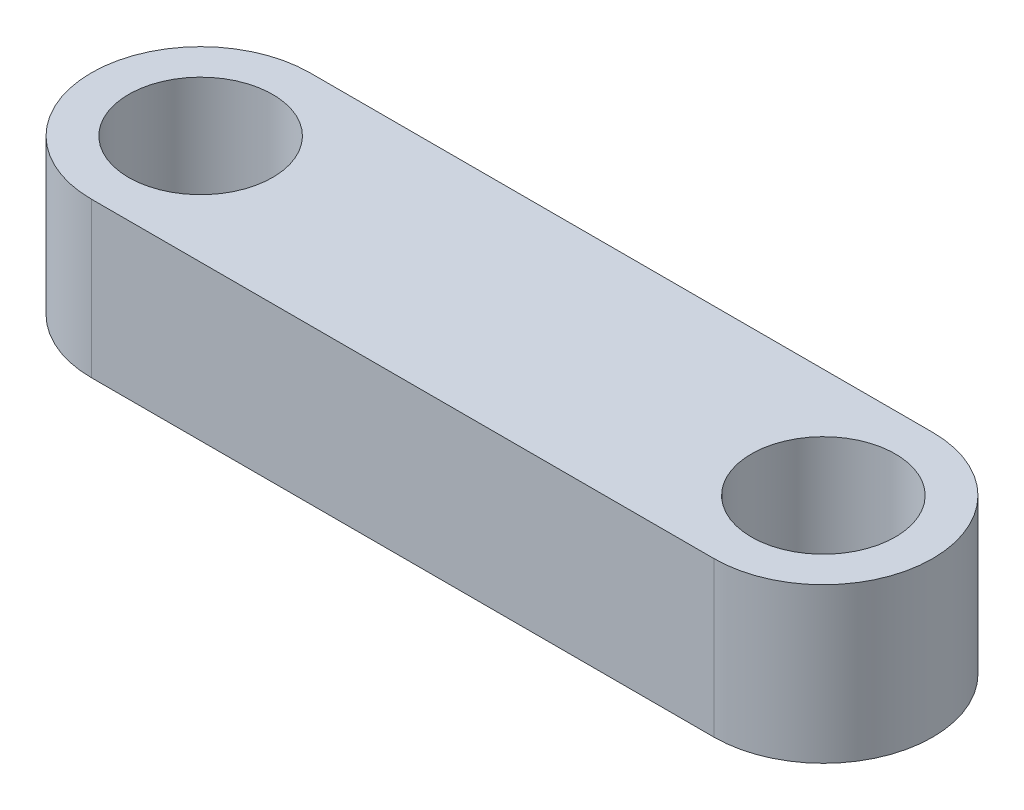
ISO-10303-21;
HEADER;
FILE_DESCRIPTION(('STEP AP214'),'2;1');
FILE_NAME('part.step','',(''),(''),'','','');
FILE_SCHEMA(('AUTOMOTIVE_DESIGN { 1 0 10303 214 1 1 1 1 }'));
ENDSEC;
DATA;
#1=APPLICATION_CONTEXT('core data for automotive mechanical design processes');
#2=APPLICATION_PROTOCOL_DEFINITION('international standard','automotive_design',2000,#1);
#3=PRODUCT_CONTEXT('',#1,'mechanical');
#4=PRODUCT('Part','Part','',(#3));
#5=PRODUCT_RELATED_PRODUCT_CATEGORY('part','',(#4));
#6=PRODUCT_DEFINITION_FORMATION('','',#4);
#7=PRODUCT_DEFINITION_CONTEXT('part definition',#1,'design');
#8=PRODUCT_DEFINITION('design','',#6,#7);
#9=PRODUCT_DEFINITION_SHAPE('','',#8);
#10=(LENGTH_UNIT() NAMED_UNIT(*) SI_UNIT(.MILLI.,.METRE.));
#11=(NAMED_UNIT(*) PLANE_ANGLE_UNIT() SI_UNIT($,.RADIAN.));
#12=(NAMED_UNIT(*) SI_UNIT($,.STERADIAN.) SOLID_ANGLE_UNIT());
#13=UNCERTAINTY_MEASURE_WITH_UNIT(LENGTH_MEASURE(1.E-05),#10,'distance_accuracy_value','');
#14=(GEOMETRIC_REPRESENTATION_CONTEXT(3) GLOBAL_UNCERTAINTY_ASSIGNED_CONTEXT((#13)) GLOBAL_UNIT_ASSIGNED_CONTEXT((#10,
#11,#12)) REPRESENTATION_CONTEXT('',''));
#15=CARTESIAN_POINT('',(0.,0.,0.));
#16=DIRECTION('',(0.,0.,1.));
#17=DIRECTION('',(1.,0.,0.));
#18=AXIS2_PLACEMENT_3D('',#15,#16,#17);
#19=CARTESIAN_POINT('',(-11.675,5.8,0.));
#20=DIRECTION('',(0.,1.,0.));
#21=DIRECTION('',(0.,0.,1.));
#22=AXIS2_PLACEMENT_3D('',#19,#20,#21);
#23=PLANE('',#22);
#24=CARTESIAN_POINT('',(-11.675,5.8,0.));
#25=DIRECTION('',(0.,1.,0.));
#26=DIRECTION('',(0.,0.,1.));
#27=AXIS2_PLACEMENT_3D('',#24,#25,#26);
#28=CIRCLE('',#27,2.7);
#29=CARTESIAN_POINT('',(-11.675,5.8,2.7));
#30=VERTEX_POINT('',#29);
#31=EDGE_CURVE('E123',#30,#30,#28,.T.);
#32=ORIENTED_EDGE('',*,*,#31,.F.);
#33=EDGE_LOOP('',(#32));
#34=FACE_BOUND('',#33,.T.);
#35=CARTESIAN_POINT('',(-11.675,5.8,0.));
#36=DIRECTION('',(0.,1.,0.));
#37=DIRECTION('',(0.,0.,1.));
#38=AXIS2_PLACEMENT_3D('',#35,#36,#37);
#39=CIRCLE('',#38,4.1);
#40=CARTESIAN_POINT('',(-11.675,5.8,-4.1));
#41=VERTEX_POINT('',#40);
#42=CARTESIAN_POINT('',(-11.675,5.8,4.1));
#43=VERTEX_POINT('',#42);
#44=EDGE_CURVE('E100',#41,#43,#39,.T.);
#45=ORIENTED_EDGE('',*,*,#44,.T.);
#46=DIRECTION('',(1.,0.,0.));
#47=VECTOR('',#46,1.);
#48=CARTESIAN_POINT('',(-11.675,5.8,4.1));
#49=LINE('',#48,#47);
#50=CARTESIAN_POINT('',(11.675,5.8,4.1));
#51=VERTEX_POINT('',#50);
#52=EDGE_CURVE('E95',#43,#51,#49,.T.);
#53=ORIENTED_EDGE('',*,*,#52,.T.);
#54=CARTESIAN_POINT('',(11.675,5.8,0.));
#55=DIRECTION('',(0.,1.,0.));
#56=DIRECTION('',(0.,0.,1.));
#57=AXIS2_PLACEMENT_3D('',#54,#55,#56);
#58=CIRCLE('',#57,4.1);
#59=CARTESIAN_POINT('',(11.675,5.8,-4.1));
#60=VERTEX_POINT('',#59);
#61=EDGE_CURVE('E98',#51,#60,#58,.T.);
#62=ORIENTED_EDGE('',*,*,#61,.T.);
#63=DIRECTION('',(-1.,0.,0.));
#64=VECTOR('',#63,1.);
#65=CARTESIAN_POINT('',(-11.675,5.8,-4.1));
#66=LINE('',#65,#64);
#67=EDGE_CURVE('E65',#60,#41,#66,.T.);
#68=ORIENTED_EDGE('',*,*,#67,.T.);
#69=EDGE_LOOP('',(#45,#53,#62,#68));
#70=FACE_BOUND('',#69,.T.);
#71=CARTESIAN_POINT('',(11.675,5.8,0.));
#72=DIRECTION('',(0.,1.,0.));
#73=DIRECTION('',(0.,0.,1.));
#74=AXIS2_PLACEMENT_3D('',#71,#72,#73);
#75=CIRCLE('',#74,2.7);
#76=CARTESIAN_POINT('',(11.675,5.8,2.7));
#77=VERTEX_POINT('',#76);
#78=EDGE_CURVE('E147',#77,#77,#75,.T.);
#79=ORIENTED_EDGE('',*,*,#78,.F.);
#80=EDGE_LOOP('',(#79));
#81=FACE_BOUND('',#80,.T.);
#82=ADVANCED_FACE('F47',(#34,#70,#81),#23,.T.);
#83=CARTESIAN_POINT('',(-11.675,0.,0.));
#84=DIRECTION('',(0.,1.,0.));
#85=DIRECTION('',(0.,0.,1.));
#86=AXIS2_PLACEMENT_3D('',#83,#84,#85);
#87=PLANE('',#86);
#88=CARTESIAN_POINT('',(-11.675,0.,0.));
#89=DIRECTION('',(0.,1.,0.));
#90=DIRECTION('',(0.,0.,1.));
#91=AXIS2_PLACEMENT_3D('',#88,#89,#90);
#92=CIRCLE('',#91,4.1);
#93=CARTESIAN_POINT('',(-11.675,0.,-4.1));
#94=VERTEX_POINT('',#93);
#95=CARTESIAN_POINT('',(-11.675,0.,4.1));
#96=VERTEX_POINT('',#95);
#97=EDGE_CURVE('E119',#94,#96,#92,.T.);
#98=ORIENTED_EDGE('',*,*,#97,.F.);
#99=DIRECTION('',(-1.,0.,0.));
#100=VECTOR('',#99,1.);
#101=CARTESIAN_POINT('',(-11.675,0.,-4.1));
#102=LINE('',#101,#100);
#103=CARTESIAN_POINT('',(11.675,0.,-4.1));
#104=VERTEX_POINT('',#103);
#105=EDGE_CURVE('E88',#104,#94,#102,.T.);
#106=ORIENTED_EDGE('',*,*,#105,.F.);
#107=CARTESIAN_POINT('',(11.675,0.,0.));
#108=DIRECTION('',(0.,1.,0.));
#109=DIRECTION('',(0.,0.,1.));
#110=AXIS2_PLACEMENT_3D('',#107,#108,#109);
#111=CIRCLE('',#110,4.1);
#112=CARTESIAN_POINT('',(11.675,0.,4.1));
#113=VERTEX_POINT('',#112);
#114=EDGE_CURVE('E82',#113,#104,#111,.T.);
#115=ORIENTED_EDGE('',*,*,#114,.F.);
#116=DIRECTION('',(1.,0.,0.));
#117=VECTOR('',#116,1.);
#118=CARTESIAN_POINT('',(-11.675,0.,4.1));
#119=LINE('',#118,#117);
#120=EDGE_CURVE('E105',#96,#113,#119,.T.);
#121=ORIENTED_EDGE('',*,*,#120,.F.);
#122=EDGE_LOOP('',(#98,#106,#115,#121));
#123=FACE_BOUND('',#122,.T.);
#124=CARTESIAN_POINT('',(-11.675,0.,0.));
#125=DIRECTION('',(0.,1.,0.));
#126=DIRECTION('',(0.,0.,1.));
#127=AXIS2_PLACEMENT_3D('',#124,#125,#126);
#128=CIRCLE('',#127,2.7);
#129=CARTESIAN_POINT('',(-11.675,0.,2.7));
#130=VERTEX_POINT('',#129);
#131=EDGE_CURVE('E143',#130,#130,#128,.T.);
#132=ORIENTED_EDGE('',*,*,#131,.T.);
#133=EDGE_LOOP('',(#132));
#134=FACE_BOUND('',#133,.T.);
#135=CARTESIAN_POINT('',(11.675,0.,0.));
#136=DIRECTION('',(0.,1.,0.));
#137=DIRECTION('',(0.,0.,1.));
#138=AXIS2_PLACEMENT_3D('',#135,#136,#137);
#139=CIRCLE('',#138,2.7);
#140=CARTESIAN_POINT('',(11.675,0.,2.7));
#141=VERTEX_POINT('',#140);
#142=EDGE_CURVE('E150',#141,#141,#139,.T.);
#143=ORIENTED_EDGE('',*,*,#142,.T.);
#144=EDGE_LOOP('',(#143));
#145=FACE_BOUND('',#144,.T.);
#146=ADVANCED_FACE('F138',(#123,#134,#145),#87,.F.);
#147=CARTESIAN_POINT('',(-11.675,5.8,0.));
#148=DIRECTION('',(0.,-1.,0.));
#149=DIRECTION('',(0.,0.,-1.));
#150=AXIS2_PLACEMENT_3D('',#147,#148,#149);
#151=CYLINDRICAL_SURFACE('',#150,4.1);
#152=ORIENTED_EDGE('',*,*,#97,.T.);
#153=DIRECTION('',(0.,-1.,0.));
#154=VECTOR('',#153,1.);
#155=CARTESIAN_POINT('',(-11.675,5.8,4.1));
#156=LINE('',#155,#154);
#157=EDGE_CURVE('E11',#43,#96,#156,.T.);
#158=ORIENTED_EDGE('',*,*,#157,.F.);
#159=ORIENTED_EDGE('',*,*,#44,.F.);
#160=DIRECTION('',(0.,-1.,0.));
#161=VECTOR('',#160,1.);
#162=CARTESIAN_POINT('',(-11.675,5.8,-4.1));
#163=LINE('',#162,#161);
#164=EDGE_CURVE('E115',#41,#94,#163,.T.);
#165=ORIENTED_EDGE('',*,*,#164,.T.);
#166=EDGE_LOOP('',(#152,#158,#159,#165));
#167=FACE_BOUND('',#166,.T.);
#168=ADVANCED_FACE('F49',(#167),#151,.T.);
#169=CARTESIAN_POINT('',(-11.675,5.8,4.1));
#170=DIRECTION('',(0.,0.,-1.));
#171=DIRECTION('',(-1.,0.,0.));
#172=AXIS2_PLACEMENT_3D('',#169,#170,#171);
#173=PLANE('',#172);
#174=ORIENTED_EDGE('',*,*,#120,.T.);
#175=DIRECTION('',(0.,-1.,0.));
#176=VECTOR('',#175,1.);
#177=CARTESIAN_POINT('',(11.675,5.8,4.1));
#178=LINE('',#177,#176);
#179=EDGE_CURVE('E57',#51,#113,#178,.T.);
#180=ORIENTED_EDGE('',*,*,#179,.F.);
#181=ORIENTED_EDGE('',*,*,#52,.F.);
#182=ORIENTED_EDGE('',*,*,#157,.T.);
#183=EDGE_LOOP('',(#174,#180,#181,#182));
#184=FACE_BOUND('',#183,.T.);
#185=ADVANCED_FACE('F104',(#184),#173,.F.);
#186=CARTESIAN_POINT('',(11.675,5.8,0.));
#187=DIRECTION('',(0.,-1.,0.));
#188=DIRECTION('',(0.,0.,-1.));
#189=AXIS2_PLACEMENT_3D('',#186,#187,#188);
#190=CYLINDRICAL_SURFACE('',#189,4.1);
#191=ORIENTED_EDGE('',*,*,#114,.T.);
#192=DIRECTION('',(0.,-1.,0.));
#193=VECTOR('',#192,1.);
#194=CARTESIAN_POINT('',(11.675,5.8,-4.1));
#195=LINE('',#194,#193);
#196=EDGE_CURVE('E107',#60,#104,#195,.T.);
#197=ORIENTED_EDGE('',*,*,#196,.F.);
#198=ORIENTED_EDGE('',*,*,#61,.F.);
#199=ORIENTED_EDGE('',*,*,#179,.T.);
#200=EDGE_LOOP('',(#191,#197,#198,#199));
#201=FACE_BOUND('',#200,.T.);
#202=ADVANCED_FACE('F108',(#201),#190,.T.);
#203=CARTESIAN_POINT('',(-11.675,5.8,-4.1));
#204=DIRECTION('',(0.,0.,1.));
#205=DIRECTION('',(1.,0.,0.));
#206=AXIS2_PLACEMENT_3D('',#203,#204,#205);
#207=PLANE('',#206);
#208=ORIENTED_EDGE('',*,*,#105,.T.);
#209=ORIENTED_EDGE('',*,*,#164,.F.);
#210=ORIENTED_EDGE('',*,*,#67,.F.);
#211=ORIENTED_EDGE('',*,*,#196,.T.);
#212=EDGE_LOOP('',(#208,#209,#210,#211));
#213=FACE_BOUND('',#212,.T.);
#214=ADVANCED_FACE('F135',(#213),#207,.F.);
#215=CARTESIAN_POINT('',(-11.675,5.8,0.));
#216=DIRECTION('',(0.,-1.,0.));
#217=DIRECTION('',(0.,0.,-1.));
#218=AXIS2_PLACEMENT_3D('',#215,#216,#217);
#219=CYLINDRICAL_SURFACE('',#218,2.7);
#220=ORIENTED_EDGE('',*,*,#31,.T.);
#221=EDGE_LOOP('',(#220));
#222=FACE_BOUND('',#221,.T.);
#223=ORIENTED_EDGE('',*,*,#131,.F.);
#224=EDGE_LOOP('',(#223));
#225=FACE_BOUND('',#224,.T.);
#226=ADVANCED_FACE('F169',(#222,#225),#219,.F.);
#227=CARTESIAN_POINT('',(11.675,5.8,0.));
#228=DIRECTION('',(0.,-1.,0.));
#229=DIRECTION('',(0.,0.,-1.));
#230=AXIS2_PLACEMENT_3D('',#227,#228,#229);
#231=CYLINDRICAL_SURFACE('',#230,2.7);
#232=ORIENTED_EDGE('',*,*,#78,.T.);
#233=EDGE_LOOP('',(#232));
#234=FACE_BOUND('',#233,.T.);
#235=ORIENTED_EDGE('',*,*,#142,.F.);
#236=EDGE_LOOP('',(#235));
#237=FACE_BOUND('',#236,.T.);
#238=ADVANCED_FACE('F158',(#234,#237),#231,.F.);
#239=CLOSED_SHELL('',(#82,#146,#168,#185,#202,#214,#226,#238));
#240=MANIFOLD_SOLID_BREP('B2',#239);
#241=ADVANCED_BREP_SHAPE_REPRESENTATION('',(#18,#240),#14);
#242=SHAPE_DEFINITION_REPRESENTATION(#9,#241);
ENDSEC;
END-ISO-10303-21;
